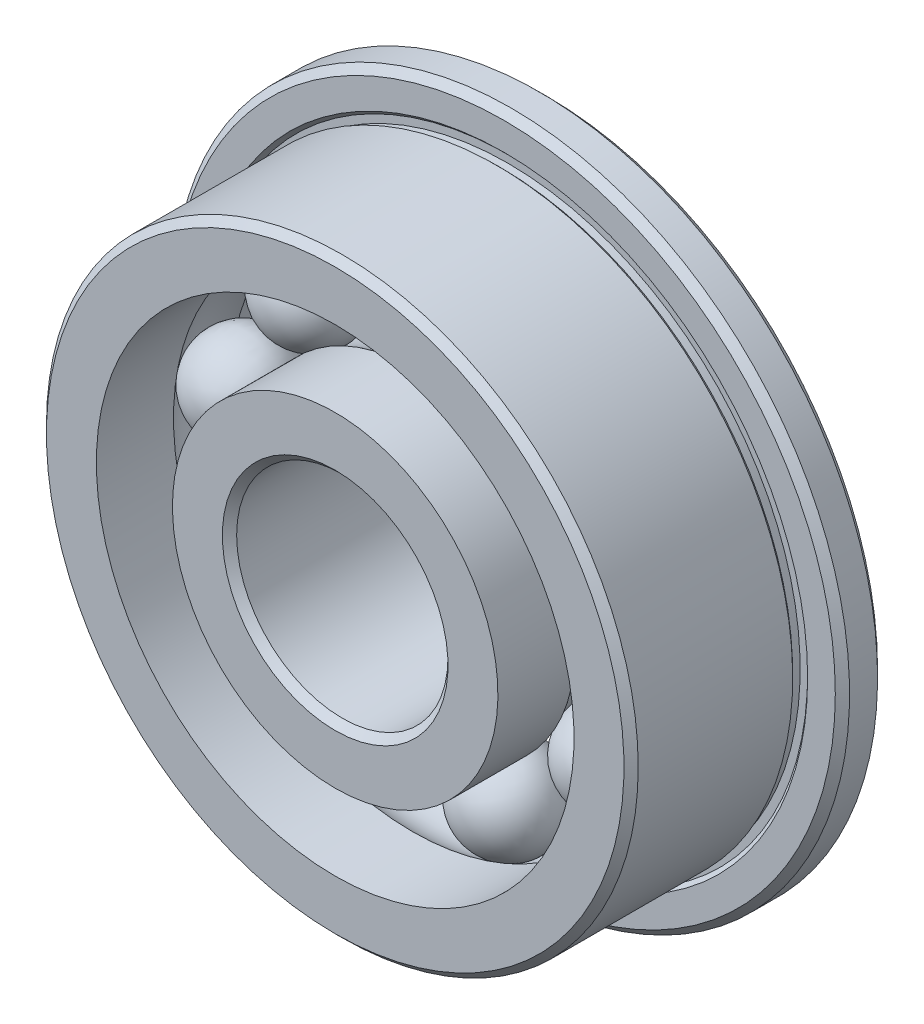
ISO-10303-21;
HEADER;
FILE_DESCRIPTION(('STEP AP214'),'2;1');
FILE_NAME('part.step','',(''),(''),'','','');
FILE_SCHEMA(('AUTOMOTIVE_DESIGN { 1 0 10303 214 1 1 1 1 }'));
ENDSEC;
DATA;
#1=APPLICATION_CONTEXT('core data for automotive mechanical design processes');
#2=APPLICATION_PROTOCOL_DEFINITION('international standard','automotive_design',2000,#1);
#3=PRODUCT_CONTEXT('',#1,'mechanical');
#4=PRODUCT('Part','Part','',(#3));
#5=PRODUCT_RELATED_PRODUCT_CATEGORY('part','',(#4));
#6=PRODUCT_DEFINITION_FORMATION('','',#4);
#7=PRODUCT_DEFINITION_CONTEXT('part definition',#1,'design');
#8=PRODUCT_DEFINITION('design','',#6,#7);
#9=PRODUCT_DEFINITION_SHAPE('','',#8);
#10=(LENGTH_UNIT() NAMED_UNIT(*) SI_UNIT(.MILLI.,.METRE.));
#11=(NAMED_UNIT(*) PLANE_ANGLE_UNIT() SI_UNIT($,.RADIAN.));
#12=(NAMED_UNIT(*) SI_UNIT($,.STERADIAN.) SOLID_ANGLE_UNIT());
#13=UNCERTAINTY_MEASURE_WITH_UNIT(LENGTH_MEASURE(1.E-05),#10,'distance_accuracy_value','');
#14=(GEOMETRIC_REPRESENTATION_CONTEXT(3) GLOBAL_UNCERTAINTY_ASSIGNED_CONTEXT((#13)) GLOBAL_UNIT_ASSIGNED_CONTEXT((#10,
#11,#12)) REPRESENTATION_CONTEXT('',''));
#15=CARTESIAN_POINT('',(0.,0.,0.));
#16=DIRECTION('',(0.,0.,1.));
#17=DIRECTION('',(1.,0.,0.));
#18=AXIS2_PLACEMENT_3D('',#15,#16,#17);
#19=CARTESIAN_POINT('',(-3.05324114601102,3.63871110481518,0.));
#20=DIRECTION('',(-0.64278760968653,0.766044443118986,0.));
#21=DIRECTION('',(0.766044443118986,0.64278760968653,0.));
#22=AXIS2_PLACEMENT_3D('',#19,#20,#21);
#23=SPHERICAL_SURFACE('',#22,1.125);
#24=CARTESIAN_POINT('',(-3.77637720690836,4.50051110332404,0.));
#25=VERTEX_POINT('',#24);
#26=VERTEX_LOOP('',#25);
#27=FACE_BOUND('',#26,.T.);
#28=ADVANCED_FACE('F41',(#27),#23,.T.);
#29=CLOSED_SHELL('',(#28));
#30=MANIFOLD_SOLID_BREP('B2',#29);
#31=CARTESIAN_POINT('',(-4.67783682680798,0.824828843917967,0.));
#32=DIRECTION('',(-0.984807753012206,0.17364817766694,0.));
#33=DIRECTION('',(0.17364817766694,0.984807753012206,0.));
#34=AXIS2_PLACEMENT_3D('',#31,#32,#33);
#35=SPHERICAL_SURFACE('',#34,1.125);
#36=CARTESIAN_POINT('',(-5.78574554894671,1.02018304379327,0.));
#37=VERTEX_POINT('',#36);
#38=VERTEX_LOOP('',#37);
#39=FACE_BOUND('',#38,.T.);
#40=ADVANCED_FACE('F61',(#39),#35,.T.);
#41=CLOSED_SHELL('',(#40));
#42=MANIFOLD_SOLID_BREP('B7',#41);
#43=CARTESIAN_POINT('',(-4.1136206679761,-2.37499999999996,0.));
#44=DIRECTION('',(-0.866025403784443,-0.499999999999992,0.));
#45=DIRECTION('',(-0.499999999999992,0.866025403784443,0.));
#46=AXIS2_PLACEMENT_3D('',#43,#44,#45);
#47=SPHERICAL_SURFACE('',#46,1.125);
#48=CARTESIAN_POINT('',(-5.0878992472336,-2.93749999999995,0.));
#49=VERTEX_POINT('',#48);
#50=VERTEX_LOOP('',#49);
#51=FACE_BOUND('',#50,.T.);
#52=ADVANCED_FACE('F81',(#51),#47,.T.);
#53=CLOSED_SHELL('',(#52));
#54=MANIFOLD_SOLID_BREP('B37',#53);
#55=CARTESIAN_POINT('',(-1.62459568079696,-4.46353994873305,0.));
#56=DIRECTION('',(-0.342020143325676,-0.939692620785906,0.));
#57=DIRECTION('',(-0.939692620785906,0.342020143325676,0.));
#58=AXIS2_PLACEMENT_3D('',#55,#56,#57);
#59=SPHERICAL_SURFACE('',#58,1.125);
#60=CARTESIAN_POINT('',(-2.00936834203834,-5.5206941471172,0.));
#61=VERTEX_POINT('',#60);
#62=VERTEX_LOOP('',#61);
#63=FACE_BOUND('',#62,.T.);
#64=ADVANCED_FACE('F101',(#63),#59,.T.);
#65=CLOSED_SHELL('',(#64));
#66=MANIFOLD_SOLID_BREP('B57',#65);
#67=CARTESIAN_POINT('',(1.6245956807969,-4.46353994873307,0.));
#68=DIRECTION('',(0.342020143325663,-0.939692620785911,0.));
#69=DIRECTION('',(-0.939692620785911,-0.342020143325663,0.));
#70=AXIS2_PLACEMENT_3D('',#67,#68,#69);
#71=SPHERICAL_SURFACE('',#70,1.125);
#72=CARTESIAN_POINT('',(2.00936834203827,-5.52069414711722,0.));
#73=VERTEX_POINT('',#72);
#74=VERTEX_LOOP('',#73);
#75=FACE_BOUND('',#74,.T.);
#76=ADVANCED_FACE('F121',(#75),#71,.T.);
#77=CLOSED_SHELL('',(#76));
#78=MANIFOLD_SOLID_BREP('B77',#77);
#79=CARTESIAN_POINT('',(4.11362066797607,-2.37500000000002,0.));
#80=DIRECTION('',(0.866025403784437,-0.500000000000004,0.));
#81=DIRECTION('',(-0.500000000000004,-0.866025403784437,0.));
#82=AXIS2_PLACEMENT_3D('',#79,#80,#81);
#83=SPHERICAL_SURFACE('',#82,1.125);
#84=CARTESIAN_POINT('',(5.08789924723356,-2.93750000000002,0.));
#85=VERTEX_POINT('',#84);
#86=VERTEX_LOOP('',#85);
#87=FACE_BOUND('',#86,.T.);
#88=ADVANCED_FACE('F141',(#87),#83,.T.);
#89=CLOSED_SHELL('',(#88));
#90=MANIFOLD_SOLID_BREP('B97',#89);
#91=CARTESIAN_POINT('',(4.67783682680799,0.824828843917905,0.));
#92=DIRECTION('',(0.984807753012209,0.173648177666928,0.));
#93=DIRECTION('',(0.173648177666928,-0.984807753012209,0.));
#94=AXIS2_PLACEMENT_3D('',#91,#92,#93);
#95=SPHERICAL_SURFACE('',#94,1.125);
#96=CARTESIAN_POINT('',(5.78574554894672,1.0201830437932,0.));
#97=VERTEX_POINT('',#96);
#98=VERTEX_LOOP('',#97);
#99=FACE_BOUND('',#98,.T.);
#100=ADVANCED_FACE('F161',(#99),#95,.T.);
#101=CLOSED_SHELL('',(#100));
#102=MANIFOLD_SOLID_BREP('B117',#101);
#103=CARTESIAN_POINT('',(3.05324114601107,3.63871110481514,0.));
#104=DIRECTION('',(0.64278760968654,0.766044443118977,0.));
#105=DIRECTION('',(0.766044443118977,-0.64278760968654,0.));
#106=AXIS2_PLACEMENT_3D('',#103,#104,#105);
#107=SPHERICAL_SURFACE('',#106,1.125);
#108=CARTESIAN_POINT('',(3.77637720690843,4.50051110332399,0.));
#109=VERTEX_POINT('',#108);
#110=VERTEX_LOOP('',#109);
#111=FACE_BOUND('',#110,.T.);
#112=ADVANCED_FACE('F181',(#111),#107,.T.);
#113=CLOSED_SHELL('',(#112));
#114=MANIFOLD_SOLID_BREP('B137',#113);
#115=CARTESIAN_POINT('',(0.,4.75,0.));
#116=DIRECTION('',(0.,1.,0.));
#117=DIRECTION('',(1.,0.,0.));
#118=AXIS2_PLACEMENT_3D('',#115,#116,#117);
#119=SPHERICAL_SURFACE('',#118,1.125);
#120=CARTESIAN_POINT('',(0.,5.875,0.));
#121=VERTEX_POINT('',#120);
#122=VERTEX_LOOP('',#121);
#123=FACE_BOUND('',#122,.T.);
#124=ADVANCED_FACE('F204',(#123),#119,.T.);
#125=CLOSED_SHELL('',(#124));
#126=MANIFOLD_SOLID_BREP('B157',#125);
#127=CARTESIAN_POINT('',(0.,0.,0.));
#128=DIRECTION('',(0.,0.,1.));
#129=DIRECTION('',(0.,-1.,0.));
#130=AXIS2_PLACEMENT_3D('',#127,#128,#129);
#131=CYLINDRICAL_SURFACE('',#130,3.85);
#132=CARTESIAN_POINT('',(0.,0.,-0.675000000000001));
#133=DIRECTION('',(0.,0.,1.));
#134=DIRECTION('',(0.,-1.,0.));
#135=AXIS2_PLACEMENT_3D('',#132,#133,#134);
#136=CIRCLE('',#135,3.85);
#137=CARTESIAN_POINT('',(0.,-3.85,-0.675000000000001));
#138=VERTEX_POINT('',#137);
#139=EDGE_CURVE('E245',#138,#138,#136,.T.);
#140=ORIENTED_EDGE('',*,*,#139,.F.);
#141=EDGE_LOOP('',(#140));
#142=FACE_BOUND('',#141,.T.);
#143=CARTESIAN_POINT('',(0.,0.,-2.5));
#144=DIRECTION('',(0.,0.,1.));
#145=DIRECTION('',(0.,-1.,0.));
#146=AXIS2_PLACEMENT_3D('',#143,#144,#145);
#147=CIRCLE('',#146,3.85);
#148=CARTESIAN_POINT('',(0.,-3.85,-2.5));
#149=VERTEX_POINT('',#148);
#150=EDGE_CURVE('E254',#149,#149,#147,.T.);
#151=ORIENTED_EDGE('',*,*,#150,.T.);
#152=EDGE_LOOP('',(#151));
#153=FACE_BOUND('',#152,.T.);
#154=ADVANCED_FACE('F225',(#142,#153),#131,.T.);
#155=CARTESIAN_POINT('',(0.,0.,0.));
#156=DIRECTION('',(0.,0.,1.));
#157=DIRECTION('',(0.,-1.,0.));
#158=AXIS2_PLACEMENT_3D('',#155,#156,#157);
#159=TOROIDAL_SURFACE('',#158,4.75,1.125);
#160=CARTESIAN_POINT('',(0.,0.,0.675000000000001));
#161=DIRECTION('',(0.,0.,1.));
#162=DIRECTION('',(0.,-1.,0.));
#163=AXIS2_PLACEMENT_3D('',#160,#161,#162);
#164=CIRCLE('',#163,3.85);
#165=CARTESIAN_POINT('',(0.,-3.85,0.675000000000001));
#166=VERTEX_POINT('',#165);
#167=EDGE_CURVE('E248',#166,#166,#164,.T.);
#168=ORIENTED_EDGE('',*,*,#167,.F.);
#169=EDGE_LOOP('',(#168));
#170=FACE_BOUND('',#169,.T.);
#171=ORIENTED_EDGE('',*,*,#139,.T.);
#172=EDGE_LOOP('',(#171));
#173=FACE_BOUND('',#172,.T.);
#174=ADVANCED_FACE('F273',(#170,#173),#159,.F.);
#175=CARTESIAN_POINT('',(0.,0.,0.));
#176=DIRECTION('',(0.,0.,1.));
#177=DIRECTION('',(0.,-1.,0.));
#178=AXIS2_PLACEMENT_3D('',#175,#176,#177);
#179=CYLINDRICAL_SURFACE('',#178,3.85);
#180=CARTESIAN_POINT('',(0.,0.,2.5));
#181=DIRECTION('',(0.,0.,1.));
#182=DIRECTION('',(0.,-1.,0.));
#183=AXIS2_PLACEMENT_3D('',#180,#181,#182);
#184=CIRCLE('',#183,3.85);
#185=CARTESIAN_POINT('',(0.,-3.85,2.5));
#186=VERTEX_POINT('',#185);
#187=EDGE_CURVE('E251',#186,#186,#184,.T.);
#188=ORIENTED_EDGE('',*,*,#187,.F.);
#189=EDGE_LOOP('',(#188));
#190=FACE_BOUND('',#189,.T.);
#191=ORIENTED_EDGE('',*,*,#167,.T.);
#192=EDGE_LOOP('',(#191));
#193=FACE_BOUND('',#192,.T.);
#194=ADVANCED_FACE('F279',(#190,#193),#179,.T.);
#195=CARTESIAN_POINT('',(0.,2.5,2.5));
#196=DIRECTION('',(0.,0.,-1.));
#197=DIRECTION('',(0.,1.,0.));
#198=AXIS2_PLACEMENT_3D('',#195,#196,#197);
#199=PLANE('',#198);
#200=CARTESIAN_POINT('',(0.,0.,2.5));
#201=DIRECTION('',(0.,0.,-1.));
#202=DIRECTION('',(0.,1.,0.));
#203=AXIS2_PLACEMENT_3D('',#200,#201,#202);
#204=CIRCLE('',#203,2.66875);
#205=CARTESIAN_POINT('',(0.,-2.66875,2.5));
#206=VERTEX_POINT('',#205);
#207=EDGE_CURVE('E203',#206,#206,#204,.T.);
#208=ORIENTED_EDGE('',*,*,#207,.T.);
#209=EDGE_LOOP('',(#208));
#210=FACE_BOUND('',#209,.T.);
#211=ORIENTED_EDGE('',*,*,#187,.T.);
#212=EDGE_LOOP('',(#211));
#213=FACE_BOUND('',#212,.T.);
#214=ADVANCED_FACE('F270',(#210,#213),#199,.F.);
#215=CARTESIAN_POINT('',(0.,0.,0.));
#216=DIRECTION('',(0.,0.,1.));
#217=DIRECTION('',(0.,-1.,0.));
#218=AXIS2_PLACEMENT_3D('',#215,#216,#217);
#219=CYLINDRICAL_SURFACE('',#218,2.5);
#220=CARTESIAN_POINT('',(0.,0.,-2.33125));
#221=DIRECTION('',(0.,0.,1.));
#222=DIRECTION('',(0.,-1.,0.));
#223=AXIS2_PLACEMENT_3D('',#220,#221,#222);
#224=CIRCLE('',#223,2.5);
#225=CARTESIAN_POINT('',(0.,-2.5,-2.33125));
#226=VERTEX_POINT('',#225);
#227=EDGE_CURVE('E232',#226,#226,#224,.F.);
#228=CARTESIAN_POINT('',(0.,0.,2.33125));
#229=DIRECTION('',(0.,0.,-1.));
#230=DIRECTION('',(0.,1.,0.));
#231=AXIS2_PLACEMENT_3D('',#228,#229,#230);
#232=CIRCLE('',#231,2.5);
#233=CARTESIAN_POINT('',(0.,-2.5,2.33125));
#234=VERTEX_POINT('',#233);
#235=EDGE_CURVE('E236',#234,#234,#232,.F.);
#236=CARTESIAN_POINT('',(0.,-2.5,-2.33125));
#237=CARTESIAN_POINT('',(0.,-2.5,-2.28268229166667));
#238=CARTESIAN_POINT('',(0.,-2.5,-2.23411458333333));
#239=CARTESIAN_POINT('',(0.,-2.5,-2.13697916666667));
#240=CARTESIAN_POINT('',(0.,-2.5,-2.08841145833333));
#241=CARTESIAN_POINT('',(0.,-2.5,-1.99127604166667));
#242=CARTESIAN_POINT('',(0.,-2.5,-1.94270833333333));
#243=CARTESIAN_POINT('',(0.,-2.5,-1.84557291666667));
#244=CARTESIAN_POINT('',(0.,-2.5,-1.79700520833333));
#245=CARTESIAN_POINT('',(0.,-2.5,-1.69986979166667));
#246=CARTESIAN_POINT('',(0.,-2.5,-1.65130208333333));
#247=CARTESIAN_POINT('',(0.,-2.5,-1.55416666666667));
#248=CARTESIAN_POINT('',(0.,-2.5,-1.50559895833333));
#249=CARTESIAN_POINT('',(0.,-2.5,-1.40846354166667));
#250=CARTESIAN_POINT('',(0.,-2.5,-1.35989583333333));
#251=CARTESIAN_POINT('',(0.,-2.5,-1.26276041666667));
#252=CARTESIAN_POINT('',(0.,-2.5,-1.21419270833333));
#253=CARTESIAN_POINT('',(0.,-2.5,-1.11705729166667));
#254=CARTESIAN_POINT('',(0.,-2.5,-1.06848958333333));
#255=CARTESIAN_POINT('',(0.,-2.5,-0.971354166666667));
#256=CARTESIAN_POINT('',(0.,-2.5,-0.922786458333334));
#257=CARTESIAN_POINT('',(0.,-2.5,-0.825651041666667));
#258=CARTESIAN_POINT('',(0.,-2.5,-0.777083333333334));
#259=CARTESIAN_POINT('',(0.,-2.5,-0.679947916666667));
#260=CARTESIAN_POINT('',(0.,-2.5,-0.631380208333334));
#261=CARTESIAN_POINT('',(0.,-2.5,-0.534244791666667));
#262=CARTESIAN_POINT('',(0.,-2.5,-0.485677083333334));
#263=CARTESIAN_POINT('',(0.,-2.5,-0.388541666666667));
#264=CARTESIAN_POINT('',(0.,-2.5,-0.339973958333334));
#265=CARTESIAN_POINT('',(0.,-2.5,-0.242838541666667));
#266=CARTESIAN_POINT('',(0.,-2.5,-0.194270833333334));
#267=CARTESIAN_POINT('',(0.,-2.5,-0.0971354166666671));
#268=CARTESIAN_POINT('',(0.,-2.5,-0.0485677083333338));
#269=CARTESIAN_POINT('',(0.,-2.5,0.0485677083333329));
#270=CARTESIAN_POINT('',(0.,-2.5,0.0971354166666662));
#271=CARTESIAN_POINT('',(0.,-2.5,0.194270833333333));
#272=CARTESIAN_POINT('',(0.,-2.5,0.242838541666666));
#273=CARTESIAN_POINT('',(0.,-2.5,0.339973958333333));
#274=CARTESIAN_POINT('',(0.,-2.5,0.388541666666666));
#275=CARTESIAN_POINT('',(0.,-2.5,0.485677083333333));
#276=CARTESIAN_POINT('',(0.,-2.5,0.534244791666666));
#277=CARTESIAN_POINT('',(0.,-2.5,0.631380208333333));
#278=CARTESIAN_POINT('',(0.,-2.5,0.679947916666666));
#279=CARTESIAN_POINT('',(0.,-2.5,0.777083333333333));
#280=CARTESIAN_POINT('',(0.,-2.5,0.825651041666666));
#281=CARTESIAN_POINT('',(0.,-2.5,0.922786458333333));
#282=CARTESIAN_POINT('',(0.,-2.5,0.971354166666666));
#283=CARTESIAN_POINT('',(0.,-2.5,1.06848958333333));
#284=CARTESIAN_POINT('',(0.,-2.5,1.11705729166667));
#285=CARTESIAN_POINT('',(0.,-2.5,1.21419270833333));
#286=CARTESIAN_POINT('',(0.,-2.5,1.26276041666667));
#287=CARTESIAN_POINT('',(0.,-2.5,1.35989583333333));
#288=CARTESIAN_POINT('',(0.,-2.5,1.40846354166667));
#289=CARTESIAN_POINT('',(0.,-2.5,1.50559895833333));
#290=CARTESIAN_POINT('',(0.,-2.5,1.55416666666667));
#291=CARTESIAN_POINT('',(0.,-2.5,1.65130208333333));
#292=CARTESIAN_POINT('',(0.,-2.5,1.69986979166667));
#293=CARTESIAN_POINT('',(0.,-2.5,1.79700520833333));
#294=CARTESIAN_POINT('',(0.,-2.5,1.84557291666667));
#295=CARTESIAN_POINT('',(0.,-2.5,1.94270833333333));
#296=CARTESIAN_POINT('',(0.,-2.5,1.99127604166667));
#297=CARTESIAN_POINT('',(0.,-2.5,2.08841145833333));
#298=CARTESIAN_POINT('',(0.,-2.5,2.13697916666667));
#299=CARTESIAN_POINT('',(0.,-2.5,2.23411458333333));
#300=CARTESIAN_POINT('',(0.,-2.5,2.28268229166667));
#301=CARTESIAN_POINT('',(0.,-2.5,2.33125));
#302=B_SPLINE_CURVE_WITH_KNOTS('',3,(#236,#237,#238,#239,#240,#241,#242,#243,#244,#245,#246,
#247,#248,#249,#250,#251,#252,#253,#254,#255,#256,#257,#258,#259,#260,#261,#262,#263,#264,#265,
#266,#267,#268,#269,#270,#271,#272,#273,#274,#275,#276,#277,#278,#279,#280,#281,#282,#283,#284,
#285,#286,#287,#288,#289,#290,#291,#292,#293,#294,#295,#296,#297,#298,#299,#300,#301),
.UNSPECIFIED.,.F.,.F.,(4,2,2,2,2,2,2,2,2,2,2,2,2,2,2,2,2,2,2,2,2,2,2,2,2,2,2,2,2,2,2,2,4),(0.,
0.145703125,0.29140625,0.437109375,0.5828125,0.728515625,0.87421875,1.019921875,1.165625,
1.311328125,1.45703125,1.602734375,1.7484375,1.894140625,2.03984375,2.185546875,2.33125,
2.476953125,2.62265625,2.768359375,2.9140625,3.059765625,3.20546875,3.351171875,3.496875,
3.642578125,3.78828125,3.933984375,4.0796875,4.225390625,4.37109375,4.516796875,4.6625),.UNSPECIFIED.);
#303=EDGE_CURVE('BSEAM262',#226,#234,#302,.T.);
#304=ORIENTED_EDGE('',*,*,#227,.T.);
#305=ORIENTED_EDGE('',*,*,#235,.T.);
#306=ORIENTED_EDGE('',*,*,#303,.T.);
#307=ORIENTED_EDGE('',*,*,#303,.F.);
#308=EDGE_LOOP('',(#304,#306,#305,#307));
#309=FACE_BOUND('',#308,.T.);
#310=ADVANCED_FACE('F262',(#309),#219,.F.);
#311=CARTESIAN_POINT('',(0.,3.85,-2.5));
#312=DIRECTION('',(0.,0.,1.));
#313=DIRECTION('',(0.,-1.,0.));
#314=AXIS2_PLACEMENT_3D('',#311,#312,#313);
#315=PLANE('',#314);
#316=CARTESIAN_POINT('',(0.,0.,-2.5));
#317=DIRECTION('',(0.,0.,1.));
#318=DIRECTION('',(0.,-1.,0.));
#319=AXIS2_PLACEMENT_3D('',#316,#317,#318);
#320=CIRCLE('',#319,2.66875);
#321=CARTESIAN_POINT('',(0.,-2.66875,-2.5));
#322=VERTEX_POINT('',#321);
#323=EDGE_CURVE('E240',#322,#322,#320,.T.);
#324=ORIENTED_EDGE('',*,*,#323,.T.);
#325=EDGE_LOOP('',(#324));
#326=FACE_BOUND('',#325,.T.);
#327=ORIENTED_EDGE('',*,*,#150,.F.);
#328=EDGE_LOOP('',(#327));
#329=FACE_BOUND('',#328,.T.);
#330=ADVANCED_FACE('F259',(#326,#329),#315,.F.);
#331=CARTESIAN_POINT('',(0.,0.,-2.5));
#332=DIRECTION('',(0.,0.,-1.));
#333=DIRECTION('',(0.,1.,0.));
#334=AXIS2_PLACEMENT_3D('',#331,#332,#333);
#335=CONICAL_SURFACE('',#334,2.66875,0.785398163397448);
#336=ORIENTED_EDGE('',*,*,#227,.F.);
#337=EDGE_LOOP('',(#336));
#338=FACE_BOUND('',#337,.T.);
#339=ORIENTED_EDGE('',*,*,#323,.F.);
#340=EDGE_LOOP('',(#339));
#341=FACE_BOUND('',#340,.T.);
#342=ADVANCED_FACE('F261',(#338,#341),#335,.F.);
#343=CARTESIAN_POINT('',(0.,0.,2.33125));
#344=DIRECTION('',(0.,0.,1.));
#345=DIRECTION('',(0.,-1.,0.));
#346=AXIS2_PLACEMENT_3D('',#343,#344,#345);
#347=CONICAL_SURFACE('',#346,2.5,0.785398163397448);
#348=CARTESIAN_POINT('',(0.,-2.66875,2.5));
#349=CARTESIAN_POINT('',(0.,-2.6669921875,2.4982421875));
#350=CARTESIAN_POINT('',(0.,-2.665234375,2.496484375));
#351=CARTESIAN_POINT('',(0.,-2.66171875,2.49296875));
#352=CARTESIAN_POINT('',(0.,-2.6599609375,2.4912109375));
#353=CARTESIAN_POINT('',(0.,-2.6564453125,2.4876953125));
#354=CARTESIAN_POINT('',(0.,-2.6546875,2.4859375));
#355=CARTESIAN_POINT('',(0.,-2.651171875,2.482421875));
#356=CARTESIAN_POINT('',(0.,-2.6494140625,2.4806640625));
#357=CARTESIAN_POINT('',(0.,-2.6458984375,2.4771484375));
#358=CARTESIAN_POINT('',(0.,-2.644140625,2.475390625));
#359=CARTESIAN_POINT('',(0.,-2.640625,2.471875));
#360=CARTESIAN_POINT('',(0.,-2.6388671875,2.4701171875));
#361=CARTESIAN_POINT('',(0.,-2.6353515625,2.4666015625));
#362=CARTESIAN_POINT('',(0.,-2.63359375,2.46484375));
#363=CARTESIAN_POINT('',(0.,-2.630078125,2.461328125));
#364=CARTESIAN_POINT('',(0.,-2.6283203125,2.4595703125));
#365=CARTESIAN_POINT('',(0.,-2.6248046875,2.4560546875));
#366=CARTESIAN_POINT('',(0.,-2.623046875,2.454296875));
#367=CARTESIAN_POINT('',(0.,-2.61953125,2.45078125));
#368=CARTESIAN_POINT('',(0.,-2.6177734375,2.4490234375));
#369=CARTESIAN_POINT('',(0.,-2.6142578125,2.4455078125));
#370=CARTESIAN_POINT('',(0.,-2.6125,2.44375));
#371=CARTESIAN_POINT('',(0.,-2.608984375,2.440234375));
#372=CARTESIAN_POINT('',(0.,-2.6072265625,2.4384765625));
#373=CARTESIAN_POINT('',(0.,-2.6037109375,2.4349609375));
#374=CARTESIAN_POINT('',(0.,-2.601953125,2.433203125));
#375=CARTESIAN_POINT('',(0.,-2.5984375,2.4296875));
#376=CARTESIAN_POINT('',(0.,-2.5966796875,2.4279296875));
#377=CARTESIAN_POINT('',(0.,-2.5931640625,2.4244140625));
#378=CARTESIAN_POINT('',(0.,-2.59140625,2.42265625));
#379=CARTESIAN_POINT('',(0.,-2.587890625,2.419140625));
#380=CARTESIAN_POINT('',(0.,-2.5861328125,2.4173828125));
#381=CARTESIAN_POINT('',(0.,-2.5826171875,2.4138671875));
#382=CARTESIAN_POINT('',(0.,-2.580859375,2.412109375));
#383=CARTESIAN_POINT('',(0.,-2.57734375,2.40859375));
#384=CARTESIAN_POINT('',(0.,-2.5755859375,2.4068359375));
#385=CARTESIAN_POINT('',(0.,-2.5720703125,2.4033203125));
#386=CARTESIAN_POINT('',(0.,-2.5703125,2.4015625));
#387=CARTESIAN_POINT('',(0.,-2.566796875,2.398046875));
#388=CARTESIAN_POINT('',(0.,-2.5650390625,2.3962890625));
#389=CARTESIAN_POINT('',(0.,-2.5615234375,2.3927734375));
#390=CARTESIAN_POINT('',(0.,-2.559765625,2.391015625));
#391=CARTESIAN_POINT('',(0.,-2.55625,2.3875));
#392=CARTESIAN_POINT('',(0.,-2.5544921875,2.3857421875));
#393=CARTESIAN_POINT('',(0.,-2.5509765625,2.3822265625));
#394=CARTESIAN_POINT('',(0.,-2.54921875,2.38046875));
#395=CARTESIAN_POINT('',(0.,-2.545703125,2.376953125));
#396=CARTESIAN_POINT('',(0.,-2.5439453125,2.3751953125));
#397=CARTESIAN_POINT('',(0.,-2.5404296875,2.3716796875));
#398=CARTESIAN_POINT('',(0.,-2.538671875,2.369921875));
#399=CARTESIAN_POINT('',(0.,-2.53515625,2.36640625));
#400=CARTESIAN_POINT('',(0.,-2.5333984375,2.3646484375));
#401=CARTESIAN_POINT('',(0.,-2.5298828125,2.3611328125));
#402=CARTESIAN_POINT('',(0.,-2.528125,2.359375));
#403=CARTESIAN_POINT('',(0.,-2.524609375,2.355859375));
#404=CARTESIAN_POINT('',(0.,-2.5228515625,2.3541015625));
#405=CARTESIAN_POINT('',(0.,-2.5193359375,2.3505859375));
#406=CARTESIAN_POINT('',(0.,-2.517578125,2.348828125));
#407=CARTESIAN_POINT('',(0.,-2.5140625,2.3453125));
#408=CARTESIAN_POINT('',(0.,-2.5123046875,2.3435546875));
#409=CARTESIAN_POINT('',(0.,-2.5087890625,2.3400390625));
#410=CARTESIAN_POINT('',(0.,-2.50703125,2.33828125));
#411=CARTESIAN_POINT('',(0.,-2.503515625,2.334765625));
#412=CARTESIAN_POINT('',(0.,-2.5017578125,2.3330078125));
#413=CARTESIAN_POINT('',(0.,-2.5,2.33125));
#414=B_SPLINE_CURVE_WITH_KNOTS('',3,(#348,#349,#350,#351,#352,#353,#354,#355,#356,#357,#358,
#359,#360,#361,#362,#363,#364,#365,#366,#367,#368,#369,#370,#371,#372,#373,#374,#375,#376,#377,
#378,#379,#380,#381,#382,#383,#384,#385,#386,#387,#388,#389,#390,#391,#392,#393,#394,#395,#396,
#397,#398,#399,#400,#401,#402,#403,#404,#405,#406,#407,#408,#409,#410,#411,#412,#413),
.UNSPECIFIED.,.F.,.F.,(4,2,2,2,2,2,2,2,2,2,2,2,2,2,2,2,2,2,2,2,2,2,2,2,2,2,2,2,2,2,2,2,4),(0.,
0.00745776683282666,0.0149155336656533,0.0223733004984803,0.0298310673313073,0.0372888341641339,
0.0447466009969612,0.0522043678297878,0.0596621346626145,0.0671199014954418,0.0745776683282684,
0.0820354351610951,0.0894932019939224,0.096950968826749,0.104408735659576,0.111866502492403,
0.11932426932523,0.126782036158056,0.134239802990884,0.14169756982371,0.149155336656537,
0.156613103489364,0.164070870322191,0.171528637155017,0.178986403987845,0.186444170820671,
0.193901937653498,0.201359704486325,0.208817471319152,0.216275238151979,0.223733004984806,
0.231190771817633,0.238648538650459),.UNSPECIFIED.);
#415=EDGE_CURVE('BSEAM227',#206,#234,#414,.T.);
#416=ORIENTED_EDGE('',*,*,#207,.F.);
#417=ORIENTED_EDGE('',*,*,#235,.F.);
#418=ORIENTED_EDGE('',*,*,#415,.T.);
#419=ORIENTED_EDGE('',*,*,#415,.F.);
#420=EDGE_LOOP('',(#416,#418,#417,#419));
#421=FACE_BOUND('',#420,.T.);
#422=ADVANCED_FACE('F227',(#421),#347,.F.);
#423=CLOSED_SHELL('',(#154,#174,#194,#214,#310,#330,#342,#422));
#424=MANIFOLD_SOLID_BREP('B177',#423);
#425=CARTESIAN_POINT('',(0.,5.65,-2.5));
#426=DIRECTION('',(0.,0.,1.));
#427=DIRECTION('',(0.,-1.,0.));
#428=AXIS2_PLACEMENT_3D('',#425,#426,#427);
#429=PLANE('',#428);
#430=CARTESIAN_POINT('',(0.,0.,-2.5));
#431=DIRECTION('',(0.,0.,1.));
#432=DIRECTION('',(0.,-1.,0.));
#433=AXIS2_PLACEMENT_3D('',#430,#431,#432);
#434=CIRCLE('',#433,7.83125);
#435=CARTESIAN_POINT('',(0.,-7.83125,-2.5));
#436=VERTEX_POINT('',#435);
#437=EDGE_CURVE('E362',#436,#436,#434,.F.);
#438=ORIENTED_EDGE('',*,*,#437,.T.);
#439=EDGE_LOOP('',(#438));
#440=FACE_BOUND('',#439,.T.);
#441=CARTESIAN_POINT('',(0.,0.,-2.5));
#442=DIRECTION('',(0.,0.,1.));
#443=DIRECTION('',(0.,-1.,0.));
#444=AXIS2_PLACEMENT_3D('',#441,#442,#443);
#445=CIRCLE('',#444,5.65);
#446=CARTESIAN_POINT('',(0.,-5.65,-2.5));
#447=VERTEX_POINT('',#446);
#448=EDGE_CURVE('E373',#447,#447,#445,.T.);
#449=ORIENTED_EDGE('',*,*,#448,.T.);
#450=EDGE_LOOP('',(#449));
#451=FACE_BOUND('',#450,.T.);
#452=ADVANCED_FACE('F347',(#440,#451),#429,.F.);
#453=CARTESIAN_POINT('',(0.,0.,0.));
#454=DIRECTION('',(0.,0.,1.));
#455=DIRECTION('',(0.,-1.,0.));
#456=AXIS2_PLACEMENT_3D('',#453,#454,#455);
#457=CYLINDRICAL_SURFACE('',#456,5.65);
#458=ORIENTED_EDGE('',*,*,#448,.F.);
#459=EDGE_LOOP('',(#458));
#460=FACE_BOUND('',#459,.T.);
#461=CARTESIAN_POINT('',(0.,0.,-0.675));
#462=DIRECTION('',(0.,0.,1.));
#463=DIRECTION('',(0.,-1.,0.));
#464=AXIS2_PLACEMENT_3D('',#461,#462,#463);
#465=CIRCLE('',#464,5.65);
#466=CARTESIAN_POINT('',(0.,-5.65,-0.675000000000001));
#467=VERTEX_POINT('',#466);
#468=EDGE_CURVE('E376',#467,#467,#465,.T.);
#469=ORIENTED_EDGE('',*,*,#468,.T.);
#470=EDGE_LOOP('',(#469));
#471=FACE_BOUND('',#470,.T.);
#472=ADVANCED_FACE('F419',(#460,#471),#457,.F.);
#473=CARTESIAN_POINT('',(0.,0.,0.));
#474=DIRECTION('',(0.,0.,1.));
#475=DIRECTION('',(0.,-1.,0.));
#476=AXIS2_PLACEMENT_3D('',#473,#474,#475);
#477=TOROIDAL_SURFACE('',#476,4.75,1.125);
#478=ORIENTED_EDGE('',*,*,#468,.F.);
#479=EDGE_LOOP('',(#478));
#480=FACE_BOUND('',#479,.T.);
#481=CARTESIAN_POINT('',(0.,0.,0.675000000000001));
#482=DIRECTION('',(0.,0.,1.));
#483=DIRECTION('',(0.,-1.,0.));
#484=AXIS2_PLACEMENT_3D('',#481,#482,#483);
#485=CIRCLE('',#484,5.65);
#486=CARTESIAN_POINT('',(0.,-5.65,0.675000000000001));
#487=VERTEX_POINT('',#486);
#488=EDGE_CURVE('E379',#487,#487,#485,.T.);
#489=ORIENTED_EDGE('',*,*,#488,.T.);
#490=EDGE_LOOP('',(#489));
#491=FACE_BOUND('',#490,.T.);
#492=ADVANCED_FACE('F425',(#480,#491),#477,.F.);
#493=CARTESIAN_POINT('',(0.,0.,0.));
#494=DIRECTION('',(0.,0.,1.));
#495=DIRECTION('',(0.,-1.,0.));
#496=AXIS2_PLACEMENT_3D('',#493,#494,#495);
#497=CYLINDRICAL_SURFACE('',#496,5.65);
#498=ORIENTED_EDGE('',*,*,#488,.F.);
#499=EDGE_LOOP('',(#498));
#500=FACE_BOUND('',#499,.T.);
#501=CARTESIAN_POINT('',(0.,0.,2.5));
#502=DIRECTION('',(0.,0.,1.));
#503=DIRECTION('',(0.,-1.,0.));
#504=AXIS2_PLACEMENT_3D('',#501,#502,#503);
#505=CIRCLE('',#504,5.65);
#506=CARTESIAN_POINT('',(0.,-5.65,2.5));
#507=VERTEX_POINT('',#506);
#508=EDGE_CURVE('E382',#507,#507,#505,.T.);
#509=ORIENTED_EDGE('',*,*,#508,.T.);
#510=EDGE_LOOP('',(#509));
#511=FACE_BOUND('',#510,.T.);
#512=ADVANCED_FACE('F489',(#500,#511),#497,.F.);
#513=CARTESIAN_POINT('',(0.,7.,2.5));
#514=DIRECTION('',(0.,0.,-1.));
#515=DIRECTION('',(0.,1.,0.));
#516=AXIS2_PLACEMENT_3D('',#513,#514,#515);
#517=PLANE('',#516);
#518=CARTESIAN_POINT('',(0.,0.,2.5));
#519=DIRECTION('',(0.,0.,-1.));
#520=DIRECTION('',(0.,1.,0.));
#521=AXIS2_PLACEMENT_3D('',#518,#519,#520);
#522=CIRCLE('',#521,6.83125);
#523=CARTESIAN_POINT('',(0.,6.83125,2.5));
#524=VERTEX_POINT('',#523);
#525=EDGE_CURVE('E354',#524,#524,#522,.F.);
#526=ORIENTED_EDGE('',*,*,#525,.T.);
#527=EDGE_LOOP('',(#526));
#528=FACE_BOUND('',#527,.T.);
#529=ORIENTED_EDGE('',*,*,#508,.F.);
#530=EDGE_LOOP('',(#529));
#531=FACE_BOUND('',#530,.T.);
#532=ADVANCED_FACE('F479',(#528,#531),#517,.F.);
#533=CARTESIAN_POINT('',(0.,0.,0.));
#534=DIRECTION('',(0.,0.,1.));
#535=DIRECTION('',(0.,-1.,0.));
#536=AXIS2_PLACEMENT_3D('',#533,#534,#535);
#537=CYLINDRICAL_SURFACE('',#536,7.);
#538=CARTESIAN_POINT('',(0.,0.,2.33125));
#539=DIRECTION('',(0.,0.,-1.));
#540=DIRECTION('',(0.,1.,0.));
#541=AXIS2_PLACEMENT_3D('',#538,#539,#540);
#542=CIRCLE('',#541,7.);
#543=CARTESIAN_POINT('',(0.,7.,2.33125));
#544=VERTEX_POINT('',#543);
#545=EDGE_CURVE('E224',#544,#544,#542,.T.);
#546=ORIENTED_EDGE('',*,*,#545,.T.);
#547=EDGE_LOOP('',(#546));
#548=FACE_BOUND('',#547,.T.);
#549=CARTESIAN_POINT('',(0.,0.,-1.32322330470336));
#550=DIRECTION('',(0.,0.,1.));
#551=DIRECTION('',(0.,-1.,0.));
#552=AXIS2_PLACEMENT_3D('',#549,#550,#551);
#553=CIRCLE('',#552,7.);
#554=CARTESIAN_POINT('',(0.,-7.,-1.32322330470336));
#555=VERTEX_POINT('',#554);
#556=EDGE_CURVE('E385',#555,#555,#553,.T.);
#557=ORIENTED_EDGE('',*,*,#556,.T.);
#558=EDGE_LOOP('',(#557));
#559=FACE_BOUND('',#558,.T.);
#560=ADVANCED_FACE('F473',(#548,#559),#537,.T.);
#561=CARTESIAN_POINT('',(0.,0.,-1.41161165235168));
#562=DIRECTION('',(0.,0.,1.));
#563=DIRECTION('',(0.,-1.,0.));
#564=AXIS2_PLACEMENT_3D('',#561,#562,#563);
#565=CONICAL_SURFACE('',#564,6.91161165235168,0.785398163397443);
#566=ORIENTED_EDGE('',*,*,#556,.F.);
#567=EDGE_LOOP('',(#566));
#568=FACE_BOUND('',#567,.T.);
#569=CARTESIAN_POINT('',(0.,0.,-1.41161165235168));
#570=DIRECTION('',(0.,0.,1.));
#571=DIRECTION('',(0.,-1.,0.));
#572=AXIS2_PLACEMENT_3D('',#569,#570,#571);
#573=CIRCLE('',#572,6.91161165235168);
#574=CARTESIAN_POINT('',(0.,-6.91161165235168,-1.41161165235168));
#575=VERTEX_POINT('',#574);
#576=EDGE_CURVE('E388',#575,#575,#573,.T.);
#577=ORIENTED_EDGE('',*,*,#576,.T.);
#578=EDGE_LOOP('',(#577));
#579=FACE_BOUND('',#578,.T.);
#580=ADVANCED_FACE('F478',(#568,#579),#565,.T.);
#581=CARTESIAN_POINT('',(0.,0.,0.));
#582=DIRECTION('',(0.,0.,1.));
#583=DIRECTION('',(0.,-1.,0.));
#584=AXIS2_PLACEMENT_3D('',#581,#582,#583);
#585=CYLINDRICAL_SURFACE('',#584,6.91161165235168);
#586=ORIENTED_EDGE('',*,*,#576,.F.);
#587=EDGE_LOOP('',(#586));
#588=FACE_BOUND('',#587,.T.);
#589=CARTESIAN_POINT('',(0.,0.,-1.58838834764832));
#590=DIRECTION('',(0.,0.,1.));
#591=DIRECTION('',(0.,-1.,0.));
#592=AXIS2_PLACEMENT_3D('',#589,#590,#591);
#593=CIRCLE('',#592,6.91161165235168);
#594=CARTESIAN_POINT('',(0.,-6.91161165235168,-1.58838834764832));
#595=VERTEX_POINT('',#594);
#596=EDGE_CURVE('E391',#595,#595,#593,.T.);
#597=ORIENTED_EDGE('',*,*,#596,.T.);
#598=EDGE_LOOP('',(#597));
#599=FACE_BOUND('',#598,.T.);
#600=ADVANCED_FACE('F511',(#588,#599),#585,.T.);
#601=CARTESIAN_POINT('',(0.,7.08838834764832,-1.58838834764832));
#602=DIRECTION('',(0.,0.,-1.));
#603=DIRECTION('',(0.,1.,0.));
#604=AXIS2_PLACEMENT_3D('',#601,#602,#603);
#605=PLANE('',#604);
#606=ORIENTED_EDGE('',*,*,#596,.F.);
#607=EDGE_LOOP('',(#606));
#608=FACE_BOUND('',#607,.T.);
#609=CARTESIAN_POINT('',(0.,0.,-1.58838834764832));
#610=DIRECTION('',(0.,0.,1.));
#611=DIRECTION('',(0.,-1.,0.));
#612=AXIS2_PLACEMENT_3D('',#609,#610,#611);
#613=CIRCLE('',#612,7.08838834764832);
#614=CARTESIAN_POINT('',(0.,-7.08838834764832,-1.58838834764832));
#615=VERTEX_POINT('',#614);
#616=EDGE_CURVE('E394',#615,#615,#613,.T.);
#617=ORIENTED_EDGE('',*,*,#616,.T.);
#618=EDGE_LOOP('',(#617));
#619=FACE_BOUND('',#618,.T.);
#620=ADVANCED_FACE('F415',(#608,#619),#605,.F.);
#621=CARTESIAN_POINT('',(0.,0.,-1.5));
#622=DIRECTION('',(0.,0.,1.));
#623=DIRECTION('',(0.,-1.,0.));
#624=AXIS2_PLACEMENT_3D('',#621,#622,#623);
#625=CONICAL_SURFACE('',#624,7.17677669529664,0.785398163397446);
#626=ORIENTED_EDGE('',*,*,#616,.F.);
#627=EDGE_LOOP('',(#626));
#628=FACE_BOUND('',#627,.T.);
#629=CARTESIAN_POINT('',(0.,0.,-1.5));
#630=DIRECTION('',(0.,0.,1.));
#631=DIRECTION('',(0.,-1.,0.));
#632=AXIS2_PLACEMENT_3D('',#629,#630,#631);
#633=CIRCLE('',#632,7.17677669529664);
#634=CARTESIAN_POINT('',(0.,-7.17677669529664,-1.5));
#635=VERTEX_POINT('',#634);
#636=EDGE_CURVE('E397',#635,#635,#633,.T.);
#637=ORIENTED_EDGE('',*,*,#636,.T.);
#638=EDGE_LOOP('',(#637));
#639=FACE_BOUND('',#638,.T.);
#640=ADVANCED_FACE('F401',(#628,#639),#625,.F.);
#641=CARTESIAN_POINT('',(0.,8.,-1.5));
#642=DIRECTION('',(0.,0.,-1.));
#643=DIRECTION('',(0.,1.,0.));
#644=AXIS2_PLACEMENT_3D('',#641,#642,#643);
#645=PLANE('',#644);
#646=CARTESIAN_POINT('',(0.,0.,-1.5));
#647=DIRECTION('',(0.,0.,-1.));
#648=DIRECTION('',(0.,1.,0.));
#649=AXIS2_PLACEMENT_3D('',#646,#647,#648);
#650=CIRCLE('',#649,7.83125);
#651=CARTESIAN_POINT('',(0.,7.83125,-1.5));
#652=VERTEX_POINT('',#651);
#653=EDGE_CURVE('E358',#652,#652,#650,.F.);
#654=ORIENTED_EDGE('',*,*,#653,.T.);
#655=EDGE_LOOP('',(#654));
#656=FACE_BOUND('',#655,.T.);
#657=ORIENTED_EDGE('',*,*,#636,.F.);
#658=EDGE_LOOP('',(#657));
#659=FACE_BOUND('',#658,.T.);
#660=ADVANCED_FACE('F403',(#656,#659),#645,.F.);
#661=CARTESIAN_POINT('',(0.,0.,0.));
#662=DIRECTION('',(0.,0.,1.));
#663=DIRECTION('',(0.,-1.,0.));
#664=AXIS2_PLACEMENT_3D('',#661,#662,#663);
#665=CYLINDRICAL_SURFACE('',#664,8.);
#666=CARTESIAN_POINT('',(0.,0.,-2.33125));
#667=DIRECTION('',(0.,0.,1.));
#668=DIRECTION('',(0.,-1.,0.));
#669=AXIS2_PLACEMENT_3D('',#666,#667,#668);
#670=CIRCLE('',#669,8.);
#671=CARTESIAN_POINT('',(0.,-8.,-2.33125));
#672=VERTEX_POINT('',#671);
#673=EDGE_CURVE('E367',#672,#672,#670,.T.);
#674=CARTESIAN_POINT('',(0.,0.,-1.66875));
#675=DIRECTION('',(0.,0.,-1.));
#676=DIRECTION('',(0.,1.,0.));
#677=AXIS2_PLACEMENT_3D('',#674,#675,#676);
#678=CIRCLE('',#677,8.);
#679=CARTESIAN_POINT('',(0.,-8.,-1.66875));
#680=VERTEX_POINT('',#679);
#681=EDGE_CURVE('E370',#680,#680,#678,.T.);
#682=CARTESIAN_POINT('',(0.,-8.,-2.33125));
#683=CARTESIAN_POINT('',(0.,-8.,-2.32434895833333));
#684=CARTESIAN_POINT('',(0.,-8.,-2.31744791666667));
#685=CARTESIAN_POINT('',(0.,-8.,-2.30364583333333));
#686=CARTESIAN_POINT('',(0.,-8.,-2.29674479166667));
#687=CARTESIAN_POINT('',(0.,-8.,-2.28294270833333));
#688=CARTESIAN_POINT('',(0.,-8.,-2.27604166666667));
#689=CARTESIAN_POINT('',(0.,-8.,-2.26223958333333));
#690=CARTESIAN_POINT('',(0.,-8.,-2.25533854166667));
#691=CARTESIAN_POINT('',(0.,-8.,-2.24153645833333));
#692=CARTESIAN_POINT('',(0.,-8.,-2.23463541666667));
#693=CARTESIAN_POINT('',(0.,-8.,-2.22083333333333));
#694=CARTESIAN_POINT('',(0.,-8.,-2.21393229166667));
#695=CARTESIAN_POINT('',(0.,-8.,-2.20013020833333));
#696=CARTESIAN_POINT('',(0.,-8.,-2.19322916666667));
#697=CARTESIAN_POINT('',(0.,-8.,-2.17942708333333));
#698=CARTESIAN_POINT('',(0.,-8.,-2.17252604166667));
#699=CARTESIAN_POINT('',(0.,-8.,-2.15872395833333));
#700=CARTESIAN_POINT('',(0.,-8.,-2.15182291666667));
#701=CARTESIAN_POINT('',(0.,-8.,-2.13802083333333));
#702=CARTESIAN_POINT('',(0.,-8.,-2.13111979166667));
#703=CARTESIAN_POINT('',(0.,-8.,-2.11731770833333));
#704=CARTESIAN_POINT('',(0.,-8.,-2.11041666666667));
#705=CARTESIAN_POINT('',(0.,-8.,-2.09661458333333));
#706=CARTESIAN_POINT('',(0.,-8.,-2.08971354166667));
#707=CARTESIAN_POINT('',(0.,-8.,-2.07591145833333));
#708=CARTESIAN_POINT('',(0.,-8.,-2.06901041666667));
#709=CARTESIAN_POINT('',(0.,-8.,-2.05520833333333));
#710=CARTESIAN_POINT('',(0.,-8.,-2.04830729166667));
#711=CARTESIAN_POINT('',(0.,-8.,-2.03450520833333));
#712=CARTESIAN_POINT('',(0.,-8.,-2.02760416666667));
#713=CARTESIAN_POINT('',(0.,-8.,-2.01380208333333));
#714=CARTESIAN_POINT('',(0.,-8.,-2.00690104166667));
#715=CARTESIAN_POINT('',(0.,-8.,-1.99309895833333));
#716=CARTESIAN_POINT('',(0.,-8.,-1.98619791666667));
#717=CARTESIAN_POINT('',(0.,-8.,-1.97239583333333));
#718=CARTESIAN_POINT('',(0.,-8.,-1.96549479166667));
#719=CARTESIAN_POINT('',(0.,-8.,-1.95169270833333));
#720=CARTESIAN_POINT('',(0.,-8.,-1.94479166666667));
#721=CARTESIAN_POINT('',(0.,-8.,-1.93098958333333));
#722=CARTESIAN_POINT('',(0.,-8.,-1.92408854166667));
#723=CARTESIAN_POINT('',(0.,-8.,-1.91028645833333));
#724=CARTESIAN_POINT('',(0.,-8.,-1.90338541666667));
#725=CARTESIAN_POINT('',(0.,-8.,-1.88958333333333));
#726=CARTESIAN_POINT('',(0.,-8.,-1.88268229166667));
#727=CARTESIAN_POINT('',(0.,-8.,-1.86888020833333));
#728=CARTESIAN_POINT('',(0.,-8.,-1.86197916666667));
#729=CARTESIAN_POINT('',(0.,-8.,-1.84817708333333));
#730=CARTESIAN_POINT('',(0.,-8.,-1.84127604166667));
#731=CARTESIAN_POINT('',(0.,-8.,-1.82747395833333));
#732=CARTESIAN_POINT('',(0.,-8.,-1.82057291666667));
#733=CARTESIAN_POINT('',(0.,-8.,-1.80677083333333));
#734=CARTESIAN_POINT('',(0.,-8.,-1.79986979166667));
#735=CARTESIAN_POINT('',(0.,-8.,-1.78606770833333));
#736=CARTESIAN_POINT('',(0.,-8.,-1.77916666666667));
#737=CARTESIAN_POINT('',(0.,-8.,-1.76536458333333));
#738=CARTESIAN_POINT('',(0.,-8.,-1.75846354166667));
#739=CARTESIAN_POINT('',(0.,-8.,-1.74466145833333));
#740=CARTESIAN_POINT('',(0.,-8.,-1.73776041666667));
#741=CARTESIAN_POINT('',(0.,-8.,-1.72395833333333));
#742=CARTESIAN_POINT('',(0.,-8.,-1.71705729166667));
#743=CARTESIAN_POINT('',(0.,-8.,-1.70325520833333));
#744=CARTESIAN_POINT('',(0.,-8.,-1.69635416666667));
#745=CARTESIAN_POINT('',(0.,-8.,-1.68255208333333));
#746=CARTESIAN_POINT('',(0.,-8.,-1.67565104166667));
#747=CARTESIAN_POINT('',(0.,-8.,-1.66875));
#748=B_SPLINE_CURVE_WITH_KNOTS('',3,(#682,#683,#684,#685,#686,#687,#688,#689,#690,#691,#692,
#693,#694,#695,#696,#697,#698,#699,#700,#701,#702,#703,#704,#705,#706,#707,#708,#709,#710,#711,
#712,#713,#714,#715,#716,#717,#718,#719,#720,#721,#722,#723,#724,#725,#726,#727,#728,#729,#730,
#731,#732,#733,#734,#735,#736,#737,#738,#739,#740,#741,#742,#743,#744,#745,#746,#747),
.UNSPECIFIED.,.F.,.F.,(4,2,2,2,2,2,2,2,2,2,2,2,2,2,2,2,2,2,2,2,2,2,2,2,2,2,2,2,2,2,2,2,4),(0.,
0.0207031249999999,0.0414062499999998,0.0621093750000001,0.0828125,0.103515625,0.12421875,
0.144921875,0.165625,0.186328125,0.20703125,0.227734375,0.2484375,0.269140625,0.28984375,
0.310546875,0.33125,0.351953125,0.37265625,0.393359375,0.4140625,0.434765625,0.45546875,
0.476171875,0.496875,0.517578125,0.53828125,0.558984375,0.5796875,0.600390625,0.62109375,
0.641796875,0.6625),.UNSPECIFIED.);
#749=EDGE_CURVE('BSEAM405',#672,#680,#748,.T.);
#750=ORIENTED_EDGE('',*,*,#673,.T.);
#751=ORIENTED_EDGE('',*,*,#681,.T.);
#752=ORIENTED_EDGE('',*,*,#749,.T.);
#753=ORIENTED_EDGE('',*,*,#749,.F.);
#754=EDGE_LOOP('',(#750,#752,#751,#753));
#755=FACE_BOUND('',#754,.T.);
#756=ADVANCED_FACE('F405',(#755),#665,.T.);
#757=CARTESIAN_POINT('',(0.,0.,-2.33125));
#758=DIRECTION('',(0.,0.,1.));
#759=DIRECTION('',(0.,-1.,0.));
#760=AXIS2_PLACEMENT_3D('',#757,#758,#759);
#761=CONICAL_SURFACE('',#760,8.,0.78539816339745);
#762=CARTESIAN_POINT('',(0.,-7.83125,-2.5));
#763=CARTESIAN_POINT('',(0.,-7.8330078125,-2.4982421875));
#764=CARTESIAN_POINT('',(0.,-7.834765625,-2.496484375));
#765=CARTESIAN_POINT('',(0.,-7.83828125,-2.49296875));
#766=CARTESIAN_POINT('',(0.,-7.8400390625,-2.4912109375));
#767=CARTESIAN_POINT('',(0.,-7.8435546875,-2.4876953125));
#768=CARTESIAN_POINT('',(0.,-7.8453125,-2.4859375));
#769=CARTESIAN_POINT('',(0.,-7.848828125,-2.482421875));
#770=CARTESIAN_POINT('',(0.,-7.8505859375,-2.4806640625));
#771=CARTESIAN_POINT('',(0.,-7.8541015625,-2.4771484375));
#772=CARTESIAN_POINT('',(0.,-7.855859375,-2.475390625));
#773=CARTESIAN_POINT('',(0.,-7.859375,-2.471875));
#774=CARTESIAN_POINT('',(0.,-7.8611328125,-2.4701171875));
#775=CARTESIAN_POINT('',(0.,-7.8646484375,-2.4666015625));
#776=CARTESIAN_POINT('',(0.,-7.86640625,-2.46484375));
#777=CARTESIAN_POINT('',(0.,-7.869921875,-2.461328125));
#778=CARTESIAN_POINT('',(0.,-7.8716796875,-2.4595703125));
#779=CARTESIAN_POINT('',(0.,-7.8751953125,-2.4560546875));
#780=CARTESIAN_POINT('',(0.,-7.876953125,-2.454296875));
#781=CARTESIAN_POINT('',(0.,-7.88046875,-2.45078125));
#782=CARTESIAN_POINT('',(0.,-7.8822265625,-2.4490234375));
#783=CARTESIAN_POINT('',(0.,-7.8857421875,-2.4455078125));
#784=CARTESIAN_POINT('',(0.,-7.8875,-2.44375));
#785=CARTESIAN_POINT('',(0.,-7.891015625,-2.440234375));
#786=CARTESIAN_POINT('',(0.,-7.8927734375,-2.4384765625));
#787=CARTESIAN_POINT('',(0.,-7.8962890625,-2.4349609375));
#788=CARTESIAN_POINT('',(0.,-7.898046875,-2.433203125));
#789=CARTESIAN_POINT('',(0.,-7.9015625,-2.4296875));
#790=CARTESIAN_POINT('',(0.,-7.9033203125,-2.4279296875));
#791=CARTESIAN_POINT('',(0.,-7.9068359375,-2.4244140625));
#792=CARTESIAN_POINT('',(0.,-7.90859375,-2.42265625));
#793=CARTESIAN_POINT('',(0.,-7.912109375,-2.419140625));
#794=CARTESIAN_POINT('',(0.,-7.9138671875,-2.4173828125));
#795=CARTESIAN_POINT('',(0.,-7.9173828125,-2.4138671875));
#796=CARTESIAN_POINT('',(0.,-7.919140625,-2.412109375));
#797=CARTESIAN_POINT('',(0.,-7.92265625,-2.40859375));
#798=CARTESIAN_POINT('',(0.,-7.9244140625,-2.4068359375));
#799=CARTESIAN_POINT('',(0.,-7.9279296875,-2.4033203125));
#800=CARTESIAN_POINT('',(0.,-7.9296875,-2.4015625));
#801=CARTESIAN_POINT('',(0.,-7.933203125,-2.398046875));
#802=CARTESIAN_POINT('',(0.,-7.9349609375,-2.3962890625));
#803=CARTESIAN_POINT('',(0.,-7.9384765625,-2.3927734375));
#804=CARTESIAN_POINT('',(0.,-7.940234375,-2.391015625));
#805=CARTESIAN_POINT('',(0.,-7.94375,-2.3875));
#806=CARTESIAN_POINT('',(0.,-7.9455078125,-2.3857421875));
#807=CARTESIAN_POINT('',(0.,-7.9490234375,-2.3822265625));
#808=CARTESIAN_POINT('',(0.,-7.95078125,-2.38046875));
#809=CARTESIAN_POINT('',(0.,-7.954296875,-2.376953125));
#810=CARTESIAN_POINT('',(0.,-7.9560546875,-2.3751953125));
#811=CARTESIAN_POINT('',(0.,-7.9595703125,-2.3716796875));
#812=CARTESIAN_POINT('',(0.,-7.961328125,-2.369921875));
#813=CARTESIAN_POINT('',(0.,-7.96484375,-2.36640625));
#814=CARTESIAN_POINT('',(0.,-7.9666015625,-2.3646484375));
#815=CARTESIAN_POINT('',(0.,-7.9701171875,-2.3611328125));
#816=CARTESIAN_POINT('',(0.,-7.971875,-2.359375));
#817=CARTESIAN_POINT('',(0.,-7.975390625,-2.355859375));
#818=CARTESIAN_POINT('',(0.,-7.9771484375,-2.3541015625));
#819=CARTESIAN_POINT('',(0.,-7.9806640625,-2.3505859375));
#820=CARTESIAN_POINT('',(0.,-7.982421875,-2.348828125));
#821=CARTESIAN_POINT('',(0.,-7.9859375,-2.3453125));
#822=CARTESIAN_POINT('',(0.,-7.9876953125,-2.3435546875));
#823=CARTESIAN_POINT('',(0.,-7.9912109375,-2.3400390625));
#824=CARTESIAN_POINT('',(0.,-7.99296875,-2.33828125));
#825=CARTESIAN_POINT('',(0.,-7.996484375,-2.334765625));
#826=CARTESIAN_POINT('',(0.,-7.9982421875,-2.3330078125));
#827=CARTESIAN_POINT('',(0.,-8.,-2.33125));
#828=B_SPLINE_CURVE_WITH_KNOTS('',3,(#762,#763,#764,#765,#766,#767,#768,#769,#770,#771,#772,
#773,#774,#775,#776,#777,#778,#779,#780,#781,#782,#783,#784,#785,#786,#787,#788,#789,#790,#791,
#792,#793,#794,#795,#796,#797,#798,#799,#800,#801,#802,#803,#804,#805,#806,#807,#808,#809,#810,
#811,#812,#813,#814,#815,#816,#817,#818,#819,#820,#821,#822,#823,#824,#825,#826,#827),
.UNSPECIFIED.,.F.,.F.,(4,2,2,2,2,2,2,2,2,2,2,2,2,2,2,2,2,2,2,2,2,2,2,2,2,2,2,2,2,2,2,2,4),(0.,
0.00745776683282666,0.0149155336656533,0.0223733004984803,0.0298310673313069,0.0372888341641336,
0.0447466009969606,0.0522043678297885,0.0596621346626151,0.0671199014954421,0.0745776683282687,
0.0820354351610954,0.0894932019939224,0.096950968826749,0.104408735659576,0.111866502492403,
0.119324269325229,0.126782036158056,0.134239802990884,0.141697569823711,0.149155336656537,
0.156613103489364,0.164070870322191,0.171528637155018,0.178986403987845,0.186444170820671,
0.193901937653498,0.201359704486325,0.208817471319153,0.21627523815198,0.223733004984807,
0.231190771817633,0.23864853865046),.UNSPECIFIED.);
#829=EDGE_CURVE('BSEAM412',#436,#672,#828,.T.);
#830=ORIENTED_EDGE('',*,*,#437,.F.);
#831=ORIENTED_EDGE('',*,*,#673,.F.);
#832=ORIENTED_EDGE('',*,*,#829,.T.);
#833=ORIENTED_EDGE('',*,*,#829,.F.);
#834=EDGE_LOOP('',(#830,#832,#831,#833));
#835=FACE_BOUND('',#834,.T.);
#836=ADVANCED_FACE('F412',(#835),#761,.T.);
#837=CARTESIAN_POINT('',(0.,0.,-1.5));
#838=DIRECTION('',(0.,0.,-1.));
#839=DIRECTION('',(0.,1.,0.));
#840=AXIS2_PLACEMENT_3D('',#837,#838,#839);
#841=CONICAL_SURFACE('',#840,7.83125,0.78539816339745);
#842=ORIENTED_EDGE('',*,*,#681,.F.);
#843=EDGE_LOOP('',(#842));
#844=FACE_BOUND('',#843,.T.);
#845=ORIENTED_EDGE('',*,*,#653,.F.);
#846=EDGE_LOOP('',(#845));
#847=FACE_BOUND('',#846,.T.);
#848=ADVANCED_FACE('F432',(#844,#847),#841,.T.);
#849=CARTESIAN_POINT('',(0.,0.,2.5));
#850=DIRECTION('',(0.,0.,-1.));
#851=DIRECTION('',(0.,1.,0.));
#852=AXIS2_PLACEMENT_3D('',#849,#850,#851);
#853=CONICAL_SURFACE('',#852,6.83125,0.78539816339745);
#854=CARTESIAN_POINT('',(0.,7.,2.33125));
#855=CARTESIAN_POINT('',(0.,6.9982421875,2.3330078125));
#856=CARTESIAN_POINT('',(0.,6.996484375,2.334765625));
#857=CARTESIAN_POINT('',(0.,6.99296875,2.33828125));
#858=CARTESIAN_POINT('',(0.,6.9912109375,2.3400390625));
#859=CARTESIAN_POINT('',(0.,6.9876953125,2.3435546875));
#860=CARTESIAN_POINT('',(0.,6.9859375,2.3453125));
#861=CARTESIAN_POINT('',(0.,6.982421875,2.348828125));
#862=CARTESIAN_POINT('',(0.,6.9806640625,2.3505859375));
#863=CARTESIAN_POINT('',(0.,6.9771484375,2.3541015625));
#864=CARTESIAN_POINT('',(0.,6.975390625,2.355859375));
#865=CARTESIAN_POINT('',(0.,6.971875,2.359375));
#866=CARTESIAN_POINT('',(0.,6.9701171875,2.3611328125));
#867=CARTESIAN_POINT('',(0.,6.9666015625,2.3646484375));
#868=CARTESIAN_POINT('',(0.,6.96484375,2.36640625));
#869=CARTESIAN_POINT('',(0.,6.961328125,2.369921875));
#870=CARTESIAN_POINT('',(0.,6.9595703125,2.3716796875));
#871=CARTESIAN_POINT('',(0.,6.9560546875,2.3751953125));
#872=CARTESIAN_POINT('',(0.,6.954296875,2.376953125));
#873=CARTESIAN_POINT('',(0.,6.95078125,2.38046875));
#874=CARTESIAN_POINT('',(0.,6.9490234375,2.3822265625));
#875=CARTESIAN_POINT('',(0.,6.9455078125,2.3857421875));
#876=CARTESIAN_POINT('',(0.,6.94375,2.3875));
#877=CARTESIAN_POINT('',(0.,6.940234375,2.391015625));
#878=CARTESIAN_POINT('',(0.,6.9384765625,2.3927734375));
#879=CARTESIAN_POINT('',(0.,6.9349609375,2.3962890625));
#880=CARTESIAN_POINT('',(0.,6.933203125,2.398046875));
#881=CARTESIAN_POINT('',(0.,6.9296875,2.4015625));
#882=CARTESIAN_POINT('',(0.,6.9279296875,2.4033203125));
#883=CARTESIAN_POINT('',(0.,6.9244140625,2.4068359375));
#884=CARTESIAN_POINT('',(0.,6.92265625,2.40859375));
#885=CARTESIAN_POINT('',(0.,6.919140625,2.412109375));
#886=CARTESIAN_POINT('',(0.,6.9173828125,2.4138671875));
#887=CARTESIAN_POINT('',(0.,6.9138671875,2.4173828125));
#888=CARTESIAN_POINT('',(0.,6.912109375,2.419140625));
#889=CARTESIAN_POINT('',(0.,6.90859375,2.42265625));
#890=CARTESIAN_POINT('',(0.,6.9068359375,2.4244140625));
#891=CARTESIAN_POINT('',(0.,6.9033203125,2.4279296875));
#892=CARTESIAN_POINT('',(0.,6.9015625,2.4296875));
#893=CARTESIAN_POINT('',(0.,6.898046875,2.433203125));
#894=CARTESIAN_POINT('',(0.,6.8962890625,2.4349609375));
#895=CARTESIAN_POINT('',(0.,6.8927734375,2.4384765625));
#896=CARTESIAN_POINT('',(0.,6.891015625,2.440234375));
#897=CARTESIAN_POINT('',(0.,6.8875,2.44375));
#898=CARTESIAN_POINT('',(0.,6.8857421875,2.4455078125));
#899=CARTESIAN_POINT('',(0.,6.8822265625,2.4490234375));
#900=CARTESIAN_POINT('',(0.,6.88046875,2.45078125));
#901=CARTESIAN_POINT('',(0.,6.876953125,2.454296875));
#902=CARTESIAN_POINT('',(0.,6.8751953125,2.4560546875));
#903=CARTESIAN_POINT('',(0.,6.8716796875,2.4595703125));
#904=CARTESIAN_POINT('',(0.,6.869921875,2.461328125));
#905=CARTESIAN_POINT('',(0.,6.86640625,2.46484375));
#906=CARTESIAN_POINT('',(0.,6.8646484375,2.4666015625));
#907=CARTESIAN_POINT('',(0.,6.8611328125,2.4701171875));
#908=CARTESIAN_POINT('',(0.,6.859375,2.471875));
#909=CARTESIAN_POINT('',(0.,6.855859375,2.475390625));
#910=CARTESIAN_POINT('',(0.,6.8541015625,2.4771484375));
#911=CARTESIAN_POINT('',(0.,6.8505859375,2.4806640625));
#912=CARTESIAN_POINT('',(0.,6.848828125,2.482421875));
#913=CARTESIAN_POINT('',(0.,6.8453125,2.4859375));
#914=CARTESIAN_POINT('',(0.,6.8435546875,2.4876953125));
#915=CARTESIAN_POINT('',(0.,6.8400390625,2.4912109375));
#916=CARTESIAN_POINT('',(0.,6.83828125,2.49296875));
#917=CARTESIAN_POINT('',(0.,6.834765625,2.496484375));
#918=CARTESIAN_POINT('',(0.,6.8330078125,2.4982421875));
#919=CARTESIAN_POINT('',(0.,6.83125,2.5));
#920=B_SPLINE_CURVE_WITH_KNOTS('',3,(#854,#855,#856,#857,#858,#859,#860,#861,#862,#863,#864,
#865,#866,#867,#868,#869,#870,#871,#872,#873,#874,#875,#876,#877,#878,#879,#880,#881,#882,#883,
#884,#885,#886,#887,#888,#889,#890,#891,#892,#893,#894,#895,#896,#897,#898,#899,#900,#901,#902,
#903,#904,#905,#906,#907,#908,#909,#910,#911,#912,#913,#914,#915,#916,#917,#918,#919),
.UNSPECIFIED.,.F.,.F.,(4,2,2,2,2,2,2,2,2,2,2,2,2,2,2,2,2,2,2,2,2,2,2,2,2,2,2,2,2,2,2,2,4),(0.,
0.00745776683282697,0.0149155336656542,0.0223733004984809,0.0298310673313079,0.0372888341641345,
0.0447466009969615,0.0522043678297888,0.0596621346626154,0.0671199014954424,0.0745776683282691,
0.0820354351610957,0.0894932019939227,0.09695096882675,0.104408735659577,0.111866502492404,
0.11932426932523,0.126782036158057,0.134239802990884,0.141697569823711,0.149155336656538,
0.156613103489365,0.164070870322191,0.171528637155019,0.178986403987846,0.186444170820672,
0.193901937653499,0.201359704486326,0.208817471319153,0.21627523815198,0.223733004984807,
0.231190771817634,0.23864853865046),.UNSPECIFIED.);
#921=EDGE_CURVE('BSEAM349',#544,#524,#920,.T.);
#922=ORIENTED_EDGE('',*,*,#545,.F.);
#923=ORIENTED_EDGE('',*,*,#525,.F.);
#924=ORIENTED_EDGE('',*,*,#921,.T.);
#925=ORIENTED_EDGE('',*,*,#921,.F.);
#926=EDGE_LOOP('',(#922,#924,#923,#925));
#927=FACE_BOUND('',#926,.T.);
#928=ADVANCED_FACE('F349',(#927),#853,.T.);
#929=CLOSED_SHELL('',(#452,#472,#492,#512,#532,#560,#580,#600,#620,#640,#660,#756,#836,#848,#928));
#930=MANIFOLD_SOLID_BREP('B198',#929);
#931=ADVANCED_BREP_SHAPE_REPRESENTATION('',(#18,#30,#42,#54,#66,#78,#90,#102,#114,#126,#424,
#930),#14);
#932=SHAPE_DEFINITION_REPRESENTATION(#9,#931);
ENDSEC;
END-ISO-10303-21;
